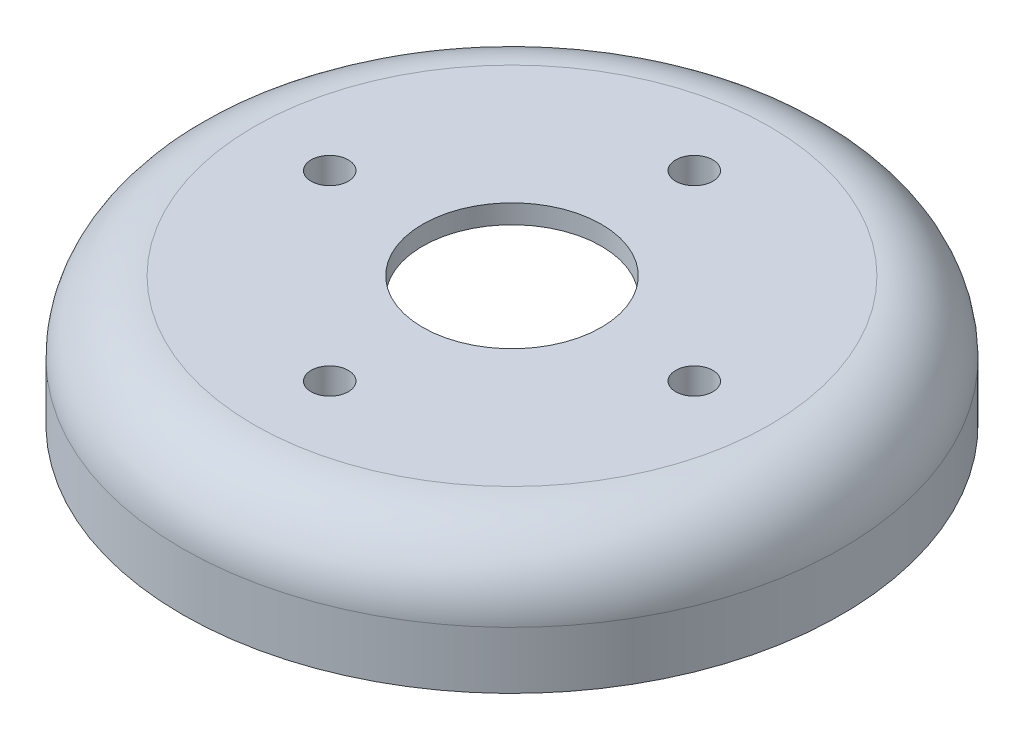
ISO-10303-21;
HEADER;
FILE_DESCRIPTION(('STEP AP214'),'2;1');
FILE_NAME('part.step','',(''),(''),'','','');
FILE_SCHEMA(('AUTOMOTIVE_DESIGN { 1 0 10303 214 1 1 1 1 }'));
ENDSEC;
DATA;
#1=APPLICATION_CONTEXT('core data for automotive mechanical design processes');
#2=APPLICATION_PROTOCOL_DEFINITION('international standard','automotive_design',2000,#1);
#3=PRODUCT_CONTEXT('',#1,'mechanical');
#4=PRODUCT('Part','Part','',(#3));
#5=PRODUCT_RELATED_PRODUCT_CATEGORY('part','',(#4));
#6=PRODUCT_DEFINITION_FORMATION('','',#4);
#7=PRODUCT_DEFINITION_CONTEXT('part definition',#1,'design');
#8=PRODUCT_DEFINITION('design','',#6,#7);
#9=PRODUCT_DEFINITION_SHAPE('','',#8);
#10=(LENGTH_UNIT() NAMED_UNIT(*) SI_UNIT(.MILLI.,.METRE.));
#11=(NAMED_UNIT(*) PLANE_ANGLE_UNIT() SI_UNIT($,.RADIAN.));
#12=(NAMED_UNIT(*) SI_UNIT($,.STERADIAN.) SOLID_ANGLE_UNIT());
#13=UNCERTAINTY_MEASURE_WITH_UNIT(LENGTH_MEASURE(1.E-05),#10,'distance_accuracy_value','');
#14=(GEOMETRIC_REPRESENTATION_CONTEXT(3) GLOBAL_UNCERTAINTY_ASSIGNED_CONTEXT((#13)) GLOBAL_UNIT_ASSIGNED_CONTEXT((#10,
#11,#12)) REPRESENTATION_CONTEXT('',''));
#15=CARTESIAN_POINT('',(0.,0.,0.));
#16=DIRECTION('',(0.,0.,1.));
#17=DIRECTION('',(1.,0.,0.));
#18=AXIS2_PLACEMENT_3D('',#15,#16,#17);
#19=CARTESIAN_POINT('',(0.,25.,0.));
#20=DIRECTION('',(0.,0.,-1.));
#21=DIRECTION('',(1.,0.,0.));
#22=AXIS2_PLACEMENT_3D('',#19,#20,#21);
#23=ELLIPSE('',#22,44.1,16.);
#24=TRIMMED_CURVE('',#23,(PARAMETER_VALUE(4.71238898038469)),
(PARAMETER_VALUE(7.85398163397448)),.T.,.PARAMETER.);
#25=CARTESIAN_POINT('',(0.,41.,0.));
#26=DIRECTION('',(0.,-1.,0.));
#27=AXIS1_PLACEMENT('',#25,#26);
#28=SURFACE_OF_REVOLUTION('',#24,#27);
#29=CARTESIAN_POINT('',(2.67122868860964E-13,37.3313317942846,-28.1));
#30=CARTESIAN_POINT('',(-0.142306873434691,37.3313338427761,-28.0999930524261));
#31=CARTESIAN_POINT('',(-0.284720527752455,37.3345259738011,-28.0882701627945));
#32=CARTESIAN_POINT('',(-0.565554287753799,37.3471809529693,-28.0417427836167));
#33=CARTESIAN_POINT('',(-0.703969257213314,37.3566515218099,-28.0069098752623));
#34=CARTESIAN_POINT('',(-0.972619592410004,37.3814870173894,-27.9153914035586));
#35=CARTESIAN_POINT('',(-1.10286494022698,37.3968445811385,-27.8587331372159));
#36=CARTESIAN_POINT('',(-1.35182114762435,37.4328868623415,-27.7254261322537));
#37=CARTESIAN_POINT('',(-1.47053409101524,37.453570614922,-27.6487810143497));
#38=CARTESIAN_POINT('',(-1.69521986678385,37.4999179504084,-27.4765076681768));
#39=CARTESIAN_POINT('',(-1.80096311461874,37.5256546980367,-27.3805999921477));
#40=CARTESIAN_POINT('',(-1.99493308067702,37.5810479488966,-27.1734360343733));
#41=CARTESIAN_POINT('',(-2.08315665231291,37.6107051546642,-27.0621770015479));
#42=CARTESIAN_POINT('',(-2.24265591545357,37.6740668799417,-26.8235407608491));
#43=CARTESIAN_POINT('',(-2.31327787760883,37.7078725146624,-26.6957534416992));
#44=CARTESIAN_POINT('',(-2.43205866781701,37.777692709103,-26.4306945528424));
#45=CARTESIAN_POINT('',(-2.48021382450186,37.8137076287616,-26.2934214372382));
#46=CARTESIAN_POINT('',(-2.55405030749385,37.888011059917,-26.0089619029531));
#47=CARTESIAN_POINT('',(-2.5790319575204,37.9263352682528,-25.8616028830053));
#48=CARTESIAN_POINT('',(-2.60345387100161,38.0031723217158,-25.5648248812369));
#49=CARTESIAN_POINT('',(-2.60289162095009,38.0416851850336,-25.4154056981436));
#50=CARTESIAN_POINT('',(-2.57601256935572,38.1183495050059,-25.1166678450923));
#51=CARTESIAN_POINT('',(-2.5493552078269,38.1564894432175,-24.9673766464918));
#52=CARTESIAN_POINT('',(-2.47035427893453,38.2308151877884,-24.6752300175285));
#53=CARTESIAN_POINT('',(-2.41801092492273,38.267001010376,-24.5323745337205));
#54=CARTESIAN_POINT('',(-2.28937985087943,38.3361257735972,-24.2584460945655));
#55=CARTESIAN_POINT('',(-2.21328170187776,38.3690877972326,-24.1272900733289));
#56=CARTESIAN_POINT('',(-2.03892385026586,38.4311340942863,-23.8795931657618));
#57=CARTESIAN_POINT('',(-1.94066689348943,38.4602188474511,-23.7630504713862));
#58=CARTESIAN_POINT('',(-1.72728994044987,38.5129901160861,-23.5510159512793));
#59=CARTESIAN_POINT('',(-1.61263998745628,38.5367910486113,-23.4550798076097));
#60=CARTESIAN_POINT('',(-1.36794180296795,38.5791664478161,-23.2839188787857));
#61=CARTESIAN_POINT('',(-1.23789630970766,38.5977418419261,-23.2086904184755));
#62=CARTESIAN_POINT('',(-0.970268767964593,38.6286243575904,-23.0834409997717));
#63=CARTESIAN_POINT('',(-0.833025966860382,38.6411014983933,-23.0327367863156));
#64=CARTESIAN_POINT('',(-0.551606919236519,38.6602168678881,-22.9549990772639));
#65=CARTESIAN_POINT('',(-0.407431694921321,38.666855954649,-22.9279621030927));
#66=CARTESIAN_POINT('',(-0.119707217003718,38.6740103110614,-22.8988246734075));
#67=CARTESIAN_POINT('',(0.0237838101355367,38.674659329903,-22.8961795849934));
#68=CARTESIAN_POINT('',(0.309153651245228,38.6701641093782,-22.9144897599824));
#69=CARTESIAN_POINT('',(0.451032562404869,38.6650202211392,-22.9354435929765));
#70=CARTESIAN_POINT('',(0.72823617017588,38.6491436752045,-23.0000400390849));
#71=CARTESIAN_POINT('',(0.863596762292676,38.638446710225,-23.0435377472742));
#72=CARTESIAN_POINT('',(1.12500024455804,38.6117936299546,-23.1517268859707));
#73=CARTESIAN_POINT('',(1.25104280441487,38.5958373283478,-23.2164190673071));
#74=CARTESIAN_POINT('',(1.4918680709356,38.5588975767552,-23.365839134178));
#75=CARTESIAN_POINT('',(1.60650335783492,38.5378580097658,-23.4507905265656));
#76=CARTESIAN_POINT('',(1.81990158024148,38.4914303176974,-23.6377200893447));
#77=CARTESIAN_POINT('',(1.91866275772123,38.4660417116129,-23.7397001430819));
#78=CARTESIAN_POINT('',(2.10017384194091,38.4109029939995,-23.9604567304529));
#79=CARTESIAN_POINT('',(2.18246302910232,38.3810599029595,-24.0795887188173));
#80=CARTESIAN_POINT('',(2.32593457353278,38.3182967068529,-24.3292047940328));
#81=CARTESIAN_POINT('',(2.38711385740124,38.2853761546234,-24.4596905304214));
#82=CARTESIAN_POINT('',(2.48846915671079,38.2163094055475,-24.7323527716134));
#83=CARTESIAN_POINT('',(2.52798292891535,38.1800972604032,-24.8747588544217));
#84=CARTESIAN_POINT('',(2.58237198862426,38.1062664731934,-25.1638501643395));
#85=CARTESIAN_POINT('',(2.5972438933638,38.0686476387464,-25.3105359761459));
#86=CARTESIAN_POINT('',(2.60211004313228,37.9921690239293,-25.6074347517141));
#87=CARTESIAN_POINT('',(2.59155277430192,37.9533001022196,-25.7576546579758));
#88=CARTESIAN_POINT('',(2.54467945816127,37.8762245045254,-26.0542064474796));
#89=CARTESIAN_POINT('',(2.50836172101106,37.8380178721544,-26.2005380750042));
#90=CARTESIAN_POINT('',(2.41059932172674,37.7632092014266,-26.4858256880305));
#91=CARTESIAN_POINT('',(2.34903697113653,37.7266155798861,-26.6247436363379));
#92=CARTESIAN_POINT('',(2.20228126399921,37.656378714025,-26.8903114969939));
#93=CARTESIAN_POINT('',(2.11709021493863,37.6227351820321,-27.0169626056456));
#94=CARTESIAN_POINT('',(1.92686860075209,37.5600658567901,-27.2520438970836));
#95=CARTESIAN_POINT('',(1.82219308694587,37.5309723343891,-27.3607430306249));
#96=CARTESIAN_POINT('',(1.59485170766245,37.4777730443141,-27.5589259438694));
#97=CARTESIAN_POINT('',(1.47218443834394,37.4536676662038,-27.6484082227968));
#98=CARTESIAN_POINT('',(1.21649886317493,37.412052239488,-27.8025471614094));
#99=CARTESIAN_POINT('',(1.08392695761435,37.3943587427173,-27.8678955797876));
#100=CARTESIAN_POINT('',(0.80914699318274,37.3652452287841,-27.9752718935421));
#101=CARTESIAN_POINT('',(0.666953767288453,37.3538157913386,-28.0173348080767));
#102=CARTESIAN_POINT('',(0.436383186810014,37.3409600784024,-28.0646176058434));
#103=CARTESIAN_POINT('',(0.34969103850503,37.3373554096008,-28.0778663422989));
#104=CARTESIAN_POINT('',(0.175346098319736,37.3325406574922,-28.095559602373));
#105=CARTESIAN_POINT('',(0.0876933234108646,37.331330531949,-28.1000042812819));
#106=CARTESIAN_POINT('',(2.67122868860964E-13,37.3313317942846,-28.1));
#107=B_SPLINE_CURVE_WITH_KNOTS('',3,(#29,#30,#31,#32,#33,#34,#35,#36,#37,#38,#39,#40,#41,#42,
#43,#44,#45,#46,#47,#48,#49,#50,#51,#52,#53,#54,#55,#56,#57,#58,#59,#60,#61,#62,#63,#64,#65,#66,
#67,#68,#69,#70,#71,#72,#73,#74,#75,#76,#77,#78,#79,#80,#81,#82,#83,#84,#85,#86,#87,#88,#89,#90,
#91,#92,#93,#94,#95,#96,#97,#98,#99,#100,#101,#102,#103,#104,#105,#106),.UNSPECIFIED.,.T.,.F.,
(4,2,2,2,2,2,2,2,2,2,2,2,2,2,2,2,2,2,2,2,2,2,2,2,2,2,2,2,2,2,2,2,2,2,2,2,2,2,4),(0.,
0.426594016365695,0.853713597864029,1.2803007056913,1.70681058880846,2.14002453006866,
2.57331620764891,3.02087555850914,3.46850802079026,3.92925350102361,4.39004431846528,
4.85693006798358,5.32381193954373,5.78705929022229,6.25024926859089,6.70213555421927,
7.15394158824088,7.59230827196769,8.03061051439033,8.4591017889713,8.88756709267247,
9.31331189815202,9.73907178757069,10.1697658440709,10.6005075663035,11.041991342711,
11.4835393678522,11.9379227942118,12.392368591857,12.8567589269715,13.3211797280657,
13.7877906928383,14.254356106238,14.713130443457,15.1719405964879,15.6163331159777,
16.060055483553,16.3229388285622,16.5858175366612),.UNSPECIFIED.);
#108=CARTESIAN_POINT('',(2.67122868860964E-13,37.3313317942846,-28.1));
#109=VERTEX_POINT('',#108);
#110=EDGE_CURVE('E82',#109,#109,#107,.T.);
#111=ORIENTED_EDGE('',*,*,#110,.T.);
#112=EDGE_LOOP('',(#111));
#113=FACE_BOUND('',#112,.T.);
#114=CARTESIAN_POINT('',(0.,38.6737213380668,22.9));
#115=CARTESIAN_POINT('',(-0.142886467899149,38.6737197732858,22.9000068491562));
#116=CARTESIAN_POINT('',(-0.285879571082559,38.670819684392,22.9118242096721));
#117=CARTESIAN_POINT('',(-0.567873630166802,38.6592952529582,22.9587405814745));
#118=CARTESIAN_POINT('',(-0.706869475610986,38.6506638953224,22.9938681244844));
#119=CARTESIAN_POINT('',(-0.976682947818749,38.6279390394313,23.086207965707));
#120=CARTESIAN_POINT('',(-1.10750914296357,38.6138513794316,23.14339665818));
#121=CARTESIAN_POINT('',(-1.35753876471003,38.5806211048273,23.278007617051));
#122=CARTESIAN_POINT('',(-1.4767445357677,38.5614795127709,23.3554257904405));
#123=CARTESIAN_POINT('',(-1.70186001787244,38.5184054065013,23.5291792041609));
#124=CARTESIAN_POINT('',(-1.8075892031433,38.494417139708,23.6257343098193));
#125=CARTESIAN_POINT('',(-2.00139081922667,38.4424490227178,23.8342556348765));
#126=CARTESIAN_POINT('',(-2.08946052559189,38.4144685577554,23.9462242277313));
#127=CARTESIAN_POINT('',(-2.24802594184411,38.3544292648229,24.185635946392));
#128=CARTESIAN_POINT('',(-2.31797377445097,38.3222796701286,24.3134191089663));
#129=CARTESIAN_POINT('',(-2.43544890005923,38.2553808247499,24.5782704584833));
#130=CARTESIAN_POINT('',(-2.48297284011484,38.2206311861919,24.7153400304799));
#131=CARTESIAN_POINT('',(-2.55558170712218,38.1484235114195,24.9989756149967));
#132=CARTESIAN_POINT('',(-2.57999965214999,38.110916840445,25.1457001686265));
#133=CARTESIAN_POINT('',(-2.60354690782133,38.0351044620681,25.4409657509096));
#134=CARTESIAN_POINT('',(-2.60267325385116,37.9967986615197,25.5895069904701));
#135=CARTESIAN_POINT('',(-2.57545591433574,37.9197601195152,25.8869222636223));
#136=CARTESIAN_POINT('',(-2.54866907091235,37.8810315554398,26.0357570691141));
#137=CARTESIAN_POINT('',(-2.46961927681884,37.8049438844818,26.326880835487));
#138=CARTESIAN_POINT('',(-2.41735550615274,37.7675848217193,26.4691695855165));
#139=CARTESIAN_POINT('',(-2.28873411449153,37.6954481572043,26.742779910762));
#140=CARTESIAN_POINT('',(-2.21242314670944,37.660665716664,26.8741221043486));
#141=CARTESIAN_POINT('',(-2.03757780081689,37.5947432858313,27.1221242052209));
#142=CARTESIAN_POINT('',(-1.9390457273241,37.5636029183169,27.2387856331394));
#143=CARTESIAN_POINT('',(-1.72482443688595,37.5067193163302,27.4512099189077));
#144=CARTESIAN_POINT('',(-1.60957210455957,37.4808702323085,27.5473846352431));
#145=CARTESIAN_POINT('',(-1.36348763001854,37.4346657173586,27.7188685007031));
#146=CARTESIAN_POINT('',(-1.23265870747254,37.4143091539622,27.7941819511656));
#147=CARTESIAN_POINT('',(-0.963894530006583,37.3804822317256,27.9191162114664));
#148=CARTESIAN_POINT('',(-0.826349834417097,37.3668020642443,27.9695205545413));
#149=CARTESIAN_POINT('',(-0.544298729959204,37.3458672518299,28.0465857558463));
#150=CARTESIAN_POINT('',(-0.399793648832703,37.3386113864946,28.0732511236914));
#151=CARTESIAN_POINT('',(-0.112324741235573,37.3309318899768,28.1014712489695));
#152=CARTESIAN_POINT('',(0.030566716419978,37.3303204725456,28.1037161817402));
#153=CARTESIAN_POINT('',(0.314668967398856,37.3354659069064,28.0848108079905));
#154=CARTESIAN_POINT('',(0.455879885559177,37.3412222826516,28.0636622503328));
#155=CARTESIAN_POINT('',(0.731430349510096,37.3588035705535,27.9989749791858));
#156=CARTESIAN_POINT('',(0.865817017695991,37.3705779647499,27.9556226480001));
#157=CARTESIAN_POINT('',(1.12530679666979,37.3997278375393,27.8480661383676));
#158=CARTESIAN_POINT('',(1.25040941277915,37.4171036143254,27.7838608497994));
#159=CARTESIAN_POINT('',(1.48992482290415,37.4571501392965,27.6354799278714));
#160=CARTESIAN_POINT('',(1.60414356149166,37.479898231563,27.5510122716154));
#161=CARTESIAN_POINT('',(1.81682824068556,37.5297670361218,27.3652297958566));
#162=CARTESIAN_POINT('',(1.91529195364557,37.5568883656717,27.2639125980736));
#163=CARTESIAN_POINT('',(2.09693151919117,37.6155471625453,27.0439691172439));
#164=CARTESIAN_POINT('',(2.17954120904998,37.6471951612286,26.9249048494671));
#165=CARTESIAN_POINT('',(2.32365689985426,37.7132616734955,26.6753272161371));
#166=CARTESIAN_POINT('',(2.38515940236782,37.7476806451907,26.5448119571247));
#167=CARTESIAN_POINT('',(2.48729998148207,37.8194358555781,26.2715471200891));
#168=CARTESIAN_POINT('',(2.52720860156311,37.8568301676056,26.128539877049));
#169=CARTESIAN_POINT('',(2.58216852467682,37.9324522469117,25.838034167456));
#170=CARTESIAN_POINT('',(2.59721663331465,37.9706801206576,25.6905351262192));
#171=CARTESIAN_POINT('',(2.60212541156158,38.0476509126815,25.392230188308));
#172=CARTESIAN_POINT('',(2.59149952792139,38.0863897230062,25.2414149383261));
#173=CARTESIAN_POINT('',(2.54423287584987,38.1625650591989,24.9435680821665));
#174=CARTESIAN_POINT('',(2.50759137094196,38.2000015481682,24.7965365832252));
#175=CARTESIAN_POINT('',(2.40918203393745,38.2724796850725,24.5107320934746));
#176=CARTESIAN_POINT('',(2.34744862158119,38.3075245371235,24.371948086926));
#177=CARTESIAN_POINT('',(2.20034913922168,38.3742781156821,24.1066365310215));
#178=CARTESIAN_POINT('',(2.11498616021495,38.405987277785,23.9801073815213));
#179=CARTESIAN_POINT('',(1.92481726950451,38.464536792526,23.7457518481962));
#180=CARTESIAN_POINT('',(1.82044320711979,38.4914632242605,23.637596768135));
#181=CARTESIAN_POINT('',(1.59392813924957,38.5404349971992,23.4404052325116));
#182=CARTESIAN_POINT('',(1.47178551909896,38.5624798943488,23.3513705162785));
#183=CARTESIAN_POINT('',(1.21705101893399,38.6004419337671,23.1977670578426));
#184=CARTESIAN_POINT('',(1.08486519923805,38.6165183268419,23.1325633395699));
#185=CARTESIAN_POINT('',(0.810995607380011,38.6429198439235,23.0253594260762));
#186=CARTESIAN_POINT('',(0.669325850240591,38.6532532533034,22.9833258041953));
#187=CARTESIAN_POINT('',(0.43883061722282,38.664935225476,22.9357826438886));
#188=CARTESIAN_POINT('',(0.351651300265703,38.6682257225908,22.9223834419516));
#189=CARTESIAN_POINT('',(0.176328185202862,38.6726192461845,22.9044900698444));
#190=CARTESIAN_POINT('',(0.0881844008406359,38.6737223037934,22.8999957729466));
#191=CARTESIAN_POINT('',(0.,38.6737213380668,22.9));
#192=B_SPLINE_CURVE_WITH_KNOTS('',3,(#114,#115,#116,#117,#118,#119,#120,#121,#122,#123,#124,
#125,#126,#127,#128,#129,#130,#131,#132,#133,#134,#135,#136,#137,#138,#139,#140,#141,#142,#143,
#144,#145,#146,#147,#148,#149,#150,#151,#152,#153,#154,#155,#156,#157,#158,#159,#160,#161,#162,
#163,#164,#165,#166,#167,#168,#169,#170,#171,#172,#173,#174,#175,#176,#177,#178,#179,#180,#181,
#182,#183,#184,#185,#186,#187,#188,#189,#190,#191),.UNSPECIFIED.,.T.,.F.,(4,2,2,2,2,2,2,2,2,2,2,
2,2,2,2,2,2,2,2,2,2,2,2,2,2,2,2,2,2,2,2,2,2,2,2,2,2,2,4),(0.,0.42833247921533,0.85719020792673,
1.28559032002297,1.71390382142704,2.14745784279894,2.58107870010756,3.02658523195556,
3.47215835733743,3.93023292636201,4.3883611898821,4.85446527630107,5.32058436565624,
5.78580466237983,6.25097673187877,6.70566159978262,7.16025264732228,7.59945284762374,
8.03856959669237,8.46524257574821,8.89188365952004,9.31500074983491,9.7381403687705,
10.1677894362626,10.5974991994387,11.0404820421583,11.4835382720932,11.9407511528778,
12.3980227776233,12.8640279968814,13.3300464088137,13.7954277074514,14.2607481580516,
14.7165823874571,15.1724580653544,15.6151052937064,16.0571122483515,16.3214674469382,
16.5858188834011),.UNSPECIFIED.);
#193=CARTESIAN_POINT('',(0.,38.6737213380668,22.9));
#194=VERTEX_POINT('',#193);
#195=EDGE_CURVE('E69',#194,#194,#192,.T.);
#196=ORIENTED_EDGE('',*,*,#195,.T.);
#197=EDGE_LOOP('',(#196));
#198=FACE_BOUND('',#197,.T.);
#199=CARTESIAN_POINT('',(0.,25.,0.));
#200=DIRECTION('',(0.,-1.,0.));
#201=DIRECTION('',(0.,0.,-1.));
#202=AXIS2_PLACEMENT_3D('',#199,#200,#201);
#203=CIRCLE('',#202,44.1);
#204=CARTESIAN_POINT('',(0.,25.,-44.1));
#205=VERTEX_POINT('',#204);
#206=EDGE_CURVE('E47',#205,#205,#203,.T.);
#207=ORIENTED_EDGE('',*,*,#206,.T.);
#208=EDGE_LOOP('',(#207));
#209=FACE_BOUND('',#208,.T.);
#210=CARTESIAN_POINT('',(0.,40.3438078106513,0.));
#211=DIRECTION('',(0.,-1.,0.));
#212=DIRECTION('',(0.,0.,-1.));
#213=AXIS2_PLACEMENT_3D('',#210,#211,#212);
#214=CIRCLE('',#213,12.5);
#215=CARTESIAN_POINT('',(0.,40.3438078106513,-12.5));
#216=VERTEX_POINT('',#215);
#217=EDGE_CURVE('E121',#216,#216,#214,.F.);
#218=ORIENTED_EDGE('',*,*,#217,.T.);
#219=EDGE_LOOP('',(#218));
#220=FACE_BOUND('',#219,.T.);
#221=CARTESIAN_POINT('',(-25.5,38.0198386904722,-2.60000000000018));
#222=CARTESIAN_POINT('',(-25.575028160352,38.0004958152863,-2.60000097197229));
#223=CARTESIAN_POINT('',(-25.650035270864,37.9811151157136,-2.59675147384701));
#224=CARTESIAN_POINT('',(-25.7995093304229,37.94240674267,-2.58378031848541));
#225=CARTESIAN_POINT('',(-25.8739762592771,37.9230790711979,-2.57405842054999));
#226=CARTESIAN_POINT('',(-26.0218991457198,37.8846004655105,-2.54818788936221));
#227=CARTESIAN_POINT('',(-26.0953542768876,37.8654496795434,-2.53203429152555));
#228=CARTESIAN_POINT('',(-26.2407230474106,37.8274666603668,-2.4933908050528));
#229=CARTESIAN_POINT('',(-26.3126351360835,37.8086347512834,-2.4708948366461));
#230=CARTESIAN_POINT('',(-26.5251064896823,37.7528732248748,-2.39411539613192));
#231=CARTESIAN_POINT('',(-26.6625986098704,37.7166263367481,-2.33050572052514));
#232=CARTESIAN_POINT('',(-26.9250075830975,37.6471725163202,-2.17995924373038));
#233=CARTESIAN_POINT('',(-27.0499266597806,37.6139650465678,-2.09302657740571));
#234=CARTESIAN_POINT('',(-27.2240632062342,37.5675123273897,-1.94762547949081));
#235=CARTESIAN_POINT('',(-27.2795821050958,37.5526738296191,-1.89703526572736));
#236=CARTESIAN_POINT('',(-27.3861425354409,37.524146745031,-1.7911164227173));
#237=CARTESIAN_POINT('',(-27.4371882376085,37.5104570875821,-1.73579230445893));
#238=CARTESIAN_POINT('',(-27.5344312981243,37.4843389905742,-1.62072944631648));
#239=CARTESIAN_POINT('',(-27.5806273378941,37.4719108940521,-1.56098951329804));
#240=CARTESIAN_POINT('',(-27.6677622903068,37.4484377414836,-1.43754105525484));
#241=CARTESIAN_POINT('',(-27.7087001732689,37.4373929563353,-1.37383175654369));
#242=CARTESIAN_POINT('',(-27.820574910886,37.4071750670889,-1.18167737786105));
#243=CARTESIAN_POINT('',(-27.8838470769132,37.3900373815746,-1.04831277990614));
#244=CARTESIAN_POINT('',(-27.9870222373576,37.3620544469813,-0.77230033487894));
#245=CARTESIAN_POINT('',(-28.0269301688261,37.3512078685451,-0.629654456099932));
#246=CARTESIAN_POINT('',(-28.0811252790164,37.3364706220523,-0.34389152680301));
#247=CARTESIAN_POINT('',(-28.0961809554761,37.3323713222893,-0.200931285673063));
#248=CARTESIAN_POINT('',(-28.1025386516896,37.3306407908959,0.0855430442917488));
#249=CARTESIAN_POINT('',(-28.0938433270195,37.3330088361581,0.229057069416948));
#250=CARTESIAN_POINT('',(-28.0533144831104,37.3440343662319,0.51038239244909));
#251=CARTESIAN_POINT('',(-28.0218192894064,37.3525998862235,0.648246271264377));
#252=CARTESIAN_POINT('',(-27.9371332068698,37.3755905177979,0.916614789597299));
#253=CARTESIAN_POINT('',(-27.883941828904,37.3900157614864,1.04711926312407));
#254=CARTESIAN_POINT('',(-27.7569857575521,37.4243623990245,1.29847083309694));
#255=CARTESIAN_POINT('',(-27.6830320443026,37.444334270346,1.41921541416512));
#256=CARTESIAN_POINT('',(-27.5170719241406,37.4890185676329,1.64658409918919));
#257=CARTESIAN_POINT('',(-27.4250633072277,37.5137315739261,1.75320647184525));
#258=CARTESIAN_POINT('',(-27.2228819673298,37.567848227281,1.9525337403522));
#259=CARTESIAN_POINT('',(-27.112272708627,37.5973638564754,2.04476523949648));
#260=CARTESIAN_POINT('',(-26.8780074048389,37.6596309972225,2.20943560744314));
#261=CARTESIAN_POINT('',(-26.754349189998,37.6923830468633,2.28187117740502));
#262=CARTESIAN_POINT('',(-26.49308135961,37.7612937626895,2.40738014852803));
#263=CARTESIAN_POINT('',(-26.3551450101836,37.7975293953896,2.45973152221349));
#264=CARTESIAN_POINT('',(-26.0727602473853,37.8713821884459,2.54037713436203));
#265=CARTESIAN_POINT('',(-25.9283109026784,37.9089995462404,2.56866792068499));
#266=CARTESIAN_POINT('',(-25.6333405925878,37.9854744318393,2.6009122746541));
#267=CARTESIAN_POINT('',(-25.482756823033,38.0243402523446,2.60427458226946));
#268=CARTESIAN_POINT('',(-25.1830688055756,38.1013480978298,2.58497656695936));
#269=CARTESIAN_POINT('',(-25.0339646444976,38.1394900804528,2.56231472592111));
#270=CARTESIAN_POINT('',(-24.7408406047164,38.2141601569285,2.49128777405532));
#271=CARTESIAN_POINT('',(-24.596845700273,38.2506804975838,2.4428111381239));
#272=CARTESIAN_POINT('',(-24.3189114075186,38.3209000810477,2.32121358545846));
#273=CARTESIAN_POINT('',(-24.184971401779,38.3545994970918,2.24809418344788));
#274=CARTESIAN_POINT('',(-23.9333338741475,38.4176974750083,2.08039762721744));
#275=CARTESIAN_POINT('',(-23.8154121691878,38.4471558440393,1.98617971780434));
#276=CARTESIAN_POINT('',(-23.5971166245722,38.5015360723466,1.77813301463604));
#277=CARTESIAN_POINT('',(-23.496740045192,38.5264586399272,1.66430728822229));
#278=CARTESIAN_POINT('',(-23.319463315721,38.5703781190669,1.42371211266836));
#279=CARTESIAN_POINT('',(-23.2419796096797,38.5895226557319,1.29739965748132));
#280=CARTESIAN_POINT('',(-23.1093816196026,38.6222352251541,1.03287019450798));
#281=CARTESIAN_POINT('',(-23.0542634185304,38.6358042344,0.894655276432621));
#282=CARTESIAN_POINT('',(-22.9695241885168,38.6566477567695,0.614426313020912));
#283=CARTESIAN_POINT('',(-22.9392315702514,38.6640880953009,0.472627457716488));
#284=CARTESIAN_POINT('',(-22.9026207369564,38.6730787430365,0.185789113138036));
#285=CARTESIAN_POINT('',(-22.8962998138891,38.6746297175513,0.0407499917730067));
#286=CARTESIAN_POINT('',(-22.9077496359516,38.671818881519,-0.245940814381126));
#287=CARTESIAN_POINT('',(-22.9251302098284,38.6675528302626,-0.387609226113347));
#288=CARTESIAN_POINT('',(-22.9827137472229,38.653403477459,-0.665930917536021));
#289=CARTESIAN_POINT('',(-23.0229163591044,38.6435202624596,-0.802584274462674));
#290=CARTESIAN_POINT('',(-23.1249071746914,38.6184049578714,-1.06727764273138));
#291=CARTESIAN_POINT('',(-23.1867269520357,38.6031650442163,-1.1953047266847));
#292=CARTESIAN_POINT('',(-23.3299817601549,38.5677703144022,-1.43910208110267));
#293=CARTESIAN_POINT('',(-23.4114173815329,38.5476153502582,-1.55487198237111));
#294=CARTESIAN_POINT('',(-23.5930695545643,38.5025338527996,-1.77317275948658));
#295=CARTESIAN_POINT('',(-23.6935983831393,38.477527806922,-1.87542715832644));
#296=CARTESIAN_POINT('',(-23.9094768055845,38.4236547691204,-2.06169130974817));
#297=CARTESIAN_POINT('',(-24.0248319387989,38.39478633398,-2.14569421155838));
#298=CARTESIAN_POINT('',(-24.2705291950318,38.3330763643496,-2.29558322939858));
#299=CARTESIAN_POINT('',(-24.4012045518795,38.3001450997489,-2.36088532507653));
#300=CARTESIAN_POINT('',(-24.6709728093838,38.2318868098307,-2.46855562921122));
#301=CARTESIAN_POINT('',(-24.8100570752265,38.1965622377658,-2.51094693373504));
#302=CARTESIAN_POINT('',(-25.041588551431,38.1375097924575,-2.56093603384876));
#303=CARTESIAN_POINT('',(-25.1326931469223,38.1142127471009,-2.57557388300833));
#304=CARTESIAN_POINT('',(-25.315875712067,38.0672423450454,-2.59510534668562));
#305=CARTESIAN_POINT('',(-25.407953697045,38.043568982419,-2.59999880756206));
#306=CARTESIAN_POINT('',(-25.5,38.0198386904722,-2.60000000000018));
#307=B_SPLINE_CURVE_WITH_KNOTS('',3,(#221,#222,#223,#224,#225,#226,#227,#228,#229,#230,#231,
#232,#233,#234,#235,#236,#237,#238,#239,#240,#241,#242,#243,#244,#245,#246,#247,#248,#249,#250,
#251,#252,#253,#254,#255,#256,#257,#258,#259,#260,#261,#262,#263,#264,#265,#266,#267,#268,#269,
#270,#271,#272,#273,#274,#275,#276,#277,#278,#279,#280,#281,#282,#283,#284,#285,#286,#287,#288,
#289,#290,#291,#292,#293,#294,#295,#296,#297,#298,#299,#300,#301,#302,#303,#304,#305,#306),
.UNSPECIFIED.,.T.,.F.,(4,2,2,2,2,2,2,2,2,2,2,2,2,2,2,2,2,2,2,2,2,2,2,2,2,2,2,2,2,2,2,2,2,2,2,2,
2,2,2,2,2,2,4),(0.,0.232356831992773,0.464722305479084,0.697267489057424,0.930036351896999,
1.39496018520496,1.85980164796126,2.0892519979859,2.31848608668666,2.54778234147812,
2.77712343007547,3.2205274863084,3.66383781383765,4.09316386033806,4.52244190628253,
4.94547718696797,5.36852200537102,5.79555059268254,6.22263148283128,6.66167311626177,
7.10078786807877,7.55446964022927,8.00821649428845,8.47269200735941,8.93719461688027,
9.40372044794005,9.87021760816114,10.3293056780462,10.7883219957734,11.2343594068702,
11.6803186663837,12.113773529996,12.5471794255619,12.9735361108409,13.3998862270988,
13.8268616817067,14.253849993503,14.6885404057455,15.1233936999538,15.5706300715933,
16.0174147451743,16.3024710498669,16.5875318490511),.UNSPECIFIED.);
#308=CARTESIAN_POINT('',(-25.5,38.0198386904722,-2.60000000000018));
#309=VERTEX_POINT('',#308);
#310=EDGE_CURVE('E77',#309,#309,#307,.T.);
#311=ORIENTED_EDGE('',*,*,#310,.T.);
#312=EDGE_LOOP('',(#311));
#313=FACE_BOUND('',#312,.T.);
#314=CARTESIAN_POINT('',(22.9,38.6737213380668,0.));
#315=CARTESIAN_POINT('',(22.9000068491562,38.6737197732858,0.14288646789906));
#316=CARTESIAN_POINT('',(22.9118242096721,38.6708196843919,0.28587957108247));
#317=CARTESIAN_POINT('',(22.9587405814745,38.6592952529582,0.567873630166714));
#318=CARTESIAN_POINT('',(22.9938681244844,38.6506638953224,0.706869475610898));
#319=CARTESIAN_POINT('',(23.086207965707,38.6279390394313,0.976682947818661));
#320=CARTESIAN_POINT('',(23.14339665818,38.6138513794316,1.10750914296348));
#321=CARTESIAN_POINT('',(23.278007617051,38.5806211048273,1.35753876470994));
#322=CARTESIAN_POINT('',(23.3554257904405,38.5614795127709,1.47674453576761));
#323=CARTESIAN_POINT('',(23.5291792041609,38.5184054065013,1.70186001787235));
#324=CARTESIAN_POINT('',(23.6257343098193,38.494417139708,1.80758920314321));
#325=CARTESIAN_POINT('',(23.8342556348765,38.4424490227178,2.00139081922659));
#326=CARTESIAN_POINT('',(23.9462242277313,38.4144685577554,2.0894605255918));
#327=CARTESIAN_POINT('',(24.185635946392,38.3544292648229,2.24802594184402));
#328=CARTESIAN_POINT('',(24.3134191089663,38.3222796701286,2.31797377445089));
#329=CARTESIAN_POINT('',(24.5782704584833,38.2553808247499,2.43544890005914));
#330=CARTESIAN_POINT('',(24.7153400304799,38.2206311861919,2.48297284011475));
#331=CARTESIAN_POINT('',(24.9989756149967,38.1484235114195,2.5555817071221));
#332=CARTESIAN_POINT('',(25.1457001686265,38.110916840445,2.5799996521499));
#333=CARTESIAN_POINT('',(25.4409657509096,38.0351044620681,2.60354690782124));
#334=CARTESIAN_POINT('',(25.5895069904701,37.9967986615197,2.60267325385106));
#335=CARTESIAN_POINT('',(25.8869222636223,37.9197601195152,2.57545591433565));
#336=CARTESIAN_POINT('',(26.0357570691141,37.8810315554398,2.54866907091227));
#337=CARTESIAN_POINT('',(26.326880835487,37.8049438844818,2.46961927681875));
#338=CARTESIAN_POINT('',(26.4691695855165,37.7675848217193,2.41735550615264));
#339=CARTESIAN_POINT('',(26.742779910762,37.6954481572043,2.28873411449143));
#340=CARTESIAN_POINT('',(26.8741221043486,37.660665716664,2.21242314670936));
#341=CARTESIAN_POINT('',(27.1221242052209,37.5947432858313,2.03757780081681));
#342=CARTESIAN_POINT('',(27.2387856331394,37.5636029183169,1.93904572732402));
#343=CARTESIAN_POINT('',(27.4512099189077,37.5067193163302,1.72482443688586));
#344=CARTESIAN_POINT('',(27.5473846352431,37.4808702323085,1.60957210455948));
#345=CARTESIAN_POINT('',(27.7188685007031,37.4346657173586,1.36348763001845));
#346=CARTESIAN_POINT('',(27.7941819511656,37.4143091539622,1.23265870747245));
#347=CARTESIAN_POINT('',(27.9191162114664,37.3804822317256,0.963894530006491));
#348=CARTESIAN_POINT('',(27.9695205545413,37.3668020642443,0.826349834417005));
#349=CARTESIAN_POINT('',(28.0465857558463,37.3458672518299,0.544298729959115));
#350=CARTESIAN_POINT('',(28.0732511236914,37.3386113864946,0.399793648832616));
#351=CARTESIAN_POINT('',(28.1014712489695,37.3309318899768,0.11232474123549));
#352=CARTESIAN_POINT('',(28.1037161817402,37.3303204725456,-0.030566716420059));
#353=CARTESIAN_POINT('',(28.0848108079905,37.3354659069064,-0.314668967398933));
#354=CARTESIAN_POINT('',(28.0636622503328,37.3412222826516,-0.455879885559252));
#355=CARTESIAN_POINT('',(27.9989749791858,37.3588035705535,-0.731430349510171));
#356=CARTESIAN_POINT('',(27.9556226480002,37.3705779647499,-0.865817017696068));
#357=CARTESIAN_POINT('',(27.8480661383677,37.3997278375393,-1.12530679666987));
#358=CARTESIAN_POINT('',(27.7838608497994,37.4171036143254,-1.25040941277924));
#359=CARTESIAN_POINT('',(27.6354799278715,37.4571501392965,-1.48992482290425));
#360=CARTESIAN_POINT('',(27.5510122716154,37.479898231563,-1.60414356149174));
#361=CARTESIAN_POINT('',(27.3652297958566,37.5297670361218,-1.81682824068565));
#362=CARTESIAN_POINT('',(27.2639125980736,37.5568883656717,-1.91529195364566));
#363=CARTESIAN_POINT('',(27.0439691172439,37.6155471625453,-2.09693151919127));
#364=CARTESIAN_POINT('',(26.9249048494671,37.6471951612286,-2.17954120905007));
#365=CARTESIAN_POINT('',(26.6753272161371,37.7132616734955,-2.32365689985435));
#366=CARTESIAN_POINT('',(26.5448119571247,37.7476806451907,-2.38515940236791));
#367=CARTESIAN_POINT('',(26.2715471200891,37.8194358555781,-2.48729998148216));
#368=CARTESIAN_POINT('',(26.128539877049,37.8568301676056,-2.52720860156319));
#369=CARTESIAN_POINT('',(25.8380341674561,37.9324522469117,-2.58216852467691));
#370=CARTESIAN_POINT('',(25.6905351262192,37.9706801206576,-2.59721663331473));
#371=CARTESIAN_POINT('',(25.392230188308,38.0476509126815,-2.60212541156167));
#372=CARTESIAN_POINT('',(25.2414149383261,38.0863897230062,-2.59149952792148));
#373=CARTESIAN_POINT('',(24.9435680821665,38.1625650591989,-2.54423287584996));
#374=CARTESIAN_POINT('',(24.7965365832252,38.2000015481682,-2.50759137094205));
#375=CARTESIAN_POINT('',(24.5107320934746,38.2724796850725,-2.40918203393752));
#376=CARTESIAN_POINT('',(24.371948086926,38.3075245371235,-2.34744862158127));
#377=CARTESIAN_POINT('',(24.1066365310215,38.3742781156821,-2.20034913922177));
#378=CARTESIAN_POINT('',(23.9801073815213,38.405987277785,-2.11498616021504));
#379=CARTESIAN_POINT('',(23.7457518481962,38.464536792526,-1.9248172695046));
#380=CARTESIAN_POINT('',(23.637596768135,38.4914632242605,-1.82044320711987));
#381=CARTESIAN_POINT('',(23.4404052325116,38.5404349971992,-1.59392813924965));
#382=CARTESIAN_POINT('',(23.3513705162785,38.5624798943488,-1.47178551909906));
#383=CARTESIAN_POINT('',(23.1977670578426,38.6004419337671,-1.21705101893409));
#384=CARTESIAN_POINT('',(23.1325633395699,38.6165183268419,-1.08486519923815));
#385=CARTESIAN_POINT('',(23.0253594260762,38.6429198439235,-0.810995607380102));
#386=CARTESIAN_POINT('',(22.9833258041953,38.6532532533034,-0.669325850240685));
#387=CARTESIAN_POINT('',(22.9357826438886,38.664935225476,-0.438830617222914));
#388=CARTESIAN_POINT('',(22.9223834419516,38.6682257225908,-0.351651300265796));
#389=CARTESIAN_POINT('',(22.9044900698444,38.6726192461845,-0.176328185202953));
#390=CARTESIAN_POINT('',(22.8999957729466,38.6737223037934,-0.0881844008407262));
#391=CARTESIAN_POINT('',(22.9,38.6737213380668,0.));
#392=B_SPLINE_CURVE_WITH_KNOTS('',3,(#314,#315,#316,#317,#318,#319,#320,#321,#322,#323,#324,
#325,#326,#327,#328,#329,#330,#331,#332,#333,#334,#335,#336,#337,#338,#339,#340,#341,#342,#343,
#344,#345,#346,#347,#348,#349,#350,#351,#352,#353,#354,#355,#356,#357,#358,#359,#360,#361,#362,
#363,#364,#365,#366,#367,#368,#369,#370,#371,#372,#373,#374,#375,#376,#377,#378,#379,#380,#381,
#382,#383,#384,#385,#386,#387,#388,#389,#390,#391),.UNSPECIFIED.,.T.,.F.,(4,2,2,2,2,2,2,2,2,2,2,
2,2,2,2,2,2,2,2,2,2,2,2,2,2,2,2,2,2,2,2,2,2,2,2,2,2,2,4),(0.,0.428332479215332,
0.857190207926731,1.28559032002297,1.71390382142704,2.14745784279895,2.58107870010757,
3.02658523195557,3.47215835733743,3.930232926362,4.38836118988207,4.85446527630104,
5.32058436565622,5.78580466237982,6.25097673187877,6.70566159978261,7.16025264732229,
7.59945284762373,8.03856959669237,8.46524257574819,8.89188365952002,9.3150007498349,
9.73814036877049,10.1677894362626,10.5974991994387,11.0404820421583,11.4835382720932,
11.9407511528778,12.3980227776233,12.8640279968814,13.3300464088137,13.7954277074514,
14.2607481580516,14.7165823874571,15.1724580653544,15.6151052937064,16.0571122483515,
16.3214674469382,16.5858188834011),.UNSPECIFIED.);
#393=CARTESIAN_POINT('',(22.9,38.6737213380668,0.));
#394=VERTEX_POINT('',#393);
#395=EDGE_CURVE('E52',#394,#394,#392,.T.);
#396=ORIENTED_EDGE('',*,*,#395,.T.);
#397=EDGE_LOOP('',(#396));
#398=FACE_BOUND('',#397,.T.);
#399=ADVANCED_FACE('F32',(#113,#198,#209,#220,#313,#398),#28,.F.);
#400=CARTESIAN_POINT('',(0.,43.,0.));
#401=DIRECTION('',(0.,1.,0.));
#402=DIRECTION('',(0.,0.,1.));
#403=AXIS2_PLACEMENT_3D('',#400,#401,#402);
#404=PLANE('',#403);
#405=CARTESIAN_POINT('',(0.,43.,0.));
#406=DIRECTION('',(0.,1.,0.));
#407=DIRECTION('',(0.,0.,1.));
#408=AXIS2_PLACEMENT_3D('',#405,#406,#407);
#409=CIRCLE('',#408,36.1);
#410=CARTESIAN_POINT('',(0.,43.,36.1));
#411=VERTEX_POINT('',#410);
#412=EDGE_CURVE('E10',#411,#411,#409,.T.);
#413=ORIENTED_EDGE('',*,*,#412,.T.);
#414=EDGE_LOOP('',(#413));
#415=FACE_BOUND('',#414,.T.);
#416=CARTESIAN_POINT('',(25.5,43.,0.));
#417=DIRECTION('',(0.,1.,0.));
#418=DIRECTION('',(0.,0.,1.));
#419=AXIS2_PLACEMENT_3D('',#416,#417,#418);
#420=CIRCLE('',#419,2.6);
#421=CARTESIAN_POINT('',(25.5,43.,2.6));
#422=VERTEX_POINT('',#421);
#423=EDGE_CURVE('E132',#422,#422,#420,.T.);
#424=ORIENTED_EDGE('',*,*,#423,.F.);
#425=EDGE_LOOP('',(#424));
#426=FACE_BOUND('',#425,.T.);
#427=CARTESIAN_POINT('',(2.670983224215E-13,43.,-25.5));
#428=DIRECTION('',(0.,1.,0.));
#429=DIRECTION('',(0.,0.,1.));
#430=AXIS2_PLACEMENT_3D('',#427,#428,#429);
#431=CIRCLE('',#430,2.6);
#432=CARTESIAN_POINT('',(2.670983224215E-13,43.,-22.9));
#433=VERTEX_POINT('',#432);
#434=EDGE_CURVE('E143',#433,#433,#431,.T.);
#435=ORIENTED_EDGE('',*,*,#434,.F.);
#436=EDGE_LOOP('',(#435));
#437=FACE_BOUND('',#436,.T.);
#438=CARTESIAN_POINT('',(-25.5,43.,-1.78065548281E-13));
#439=DIRECTION('',(0.,1.,0.));
#440=DIRECTION('',(0.,0.,1.));
#441=AXIS2_PLACEMENT_3D('',#438,#439,#440);
#442=CIRCLE('',#441,2.6);
#443=CARTESIAN_POINT('',(-25.5,43.,2.59999999999982));
#444=VERTEX_POINT('',#443);
#445=EDGE_CURVE('E140',#444,#444,#442,.T.);
#446=ORIENTED_EDGE('',*,*,#445,.F.);
#447=EDGE_LOOP('',(#446));
#448=FACE_BOUND('',#447,.T.);
#449=CARTESIAN_POINT('',(0.,43.,25.5));
#450=DIRECTION('',(0.,1.,0.));
#451=DIRECTION('',(0.,0.,1.));
#452=AXIS2_PLACEMENT_3D('',#449,#450,#451);
#453=CIRCLE('',#452,2.6);
#454=CARTESIAN_POINT('',(0.,43.,28.1));
#455=VERTEX_POINT('',#454);
#456=EDGE_CURVE('E137',#455,#455,#453,.T.);
#457=ORIENTED_EDGE('',*,*,#456,.F.);
#458=EDGE_LOOP('',(#457));
#459=FACE_BOUND('',#458,.T.);
#460=CARTESIAN_POINT('',(0.,43.,0.));
#461=DIRECTION('',(0.,1.,0.));
#462=DIRECTION('',(0.,0.,1.));
#463=AXIS2_PLACEMENT_3D('',#460,#461,#462);
#464=CIRCLE('',#463,12.5);
#465=CARTESIAN_POINT('',(0.,43.,12.5));
#466=VERTEX_POINT('',#465);
#467=EDGE_CURVE('E134',#466,#466,#464,.T.);
#468=ORIENTED_EDGE('',*,*,#467,.F.);
#469=EDGE_LOOP('',(#468));
#470=FACE_BOUND('',#469,.T.);
#471=ADVANCED_FACE('F63',(#415,#426,#437,#448,#459,#470),#404,.T.);
#472=CARTESIAN_POINT('',(0.,41.,0.));
#473=DIRECTION('',(0.,-1.,0.));
#474=DIRECTION('',(0.,0.,-1.));
#475=AXIS2_PLACEMENT_3D('',#472,#473,#474);
#476=CYLINDRICAL_SURFACE('',#475,46.1);
#477=CARTESIAN_POINT('',(0.,33.,0.));
#478=DIRECTION('',(0.,1.,0.));
#479=DIRECTION('',(0.,0.,1.));
#480=AXIS2_PLACEMENT_3D('',#477,#478,#479);
#481=CIRCLE('',#480,46.1);
#482=CARTESIAN_POINT('',(0.,33.,46.1));
#483=VERTEX_POINT('',#482);
#484=EDGE_CURVE('E39',#483,#483,#481,.F.);
#485=ORIENTED_EDGE('',*,*,#484,.T.);
#486=EDGE_LOOP('',(#485));
#487=FACE_BOUND('',#486,.T.);
#488=CARTESIAN_POINT('',(0.,25.,0.));
#489=DIRECTION('',(0.,-1.,0.));
#490=DIRECTION('',(0.,0.,-1.));
#491=AXIS2_PLACEMENT_3D('',#488,#489,#490);
#492=CIRCLE('',#491,46.1);
#493=CARTESIAN_POINT('',(0.,25.,-46.1));
#494=VERTEX_POINT('',#493);
#495=EDGE_CURVE('E43',#494,#494,#492,.T.);
#496=ORIENTED_EDGE('',*,*,#495,.F.);
#497=EDGE_LOOP('',(#496));
#498=FACE_BOUND('',#497,.T.);
#499=ADVANCED_FACE('F106',(#487,#498),#476,.T.);
#500=CARTESIAN_POINT('',(46.1,25.,0.));
#501=DIRECTION('',(0.,-1.,0.));
#502=DIRECTION('',(0.,0.,-1.));
#503=AXIS2_PLACEMENT_3D('',#500,#501,#502);
#504=PLANE('',#503);
#505=ORIENTED_EDGE('',*,*,#495,.T.);
#506=EDGE_LOOP('',(#505));
#507=FACE_BOUND('',#506,.T.);
#508=ORIENTED_EDGE('',*,*,#206,.F.);
#509=EDGE_LOOP('',(#508));
#510=FACE_BOUND('',#509,.T.);
#511=ADVANCED_FACE('F99',(#507,#510),#504,.T.);
#512=CARTESIAN_POINT('',(0.,43.,0.));
#513=DIRECTION('',(0.,-1.,0.));
#514=DIRECTION('',(0.,0.,-1.));
#515=AXIS2_PLACEMENT_3D('',#512,#513,#514);
#516=CYLINDRICAL_SURFACE('',#515,12.5);
#517=ORIENTED_EDGE('',*,*,#217,.F.);
#518=EDGE_LOOP('',(#517));
#519=FACE_BOUND('',#518,.T.);
#520=ORIENTED_EDGE('',*,*,#467,.T.);
#521=EDGE_LOOP('',(#520));
#522=FACE_BOUND('',#521,.T.);
#523=ADVANCED_FACE('F96',(#519,#522),#516,.F.);
#524=CARTESIAN_POINT('',(0.,43.,25.5));
#525=DIRECTION('',(0.,-1.,0.));
#526=DIRECTION('',(0.,0.,-1.));
#527=AXIS2_PLACEMENT_3D('',#524,#525,#526);
#528=CYLINDRICAL_SURFACE('',#527,2.6);
#529=ORIENTED_EDGE('',*,*,#195,.F.);
#530=EDGE_LOOP('',(#529));
#531=FACE_BOUND('',#530,.T.);
#532=ORIENTED_EDGE('',*,*,#456,.T.);
#533=EDGE_LOOP('',(#532));
#534=FACE_BOUND('',#533,.T.);
#535=ADVANCED_FACE('F98',(#531,#534),#528,.F.);
#536=CARTESIAN_POINT('',(-25.5,43.,-1.78065548281E-13));
#537=DIRECTION('',(0.,-1.,0.));
#538=DIRECTION('',(0.,0.,-1.));
#539=AXIS2_PLACEMENT_3D('',#536,#537,#538);
#540=CYLINDRICAL_SURFACE('',#539,2.6);
#541=ORIENTED_EDGE('',*,*,#310,.F.);
#542=EDGE_LOOP('',(#541));
#543=FACE_BOUND('',#542,.T.);
#544=ORIENTED_EDGE('',*,*,#445,.T.);
#545=EDGE_LOOP('',(#544));
#546=FACE_BOUND('',#545,.T.);
#547=ADVANCED_FACE('F93',(#543,#546),#540,.F.);
#548=CARTESIAN_POINT('',(2.670983224215E-13,43.,-25.5));
#549=DIRECTION('',(0.,-1.,0.));
#550=DIRECTION('',(0.,0.,-1.));
#551=AXIS2_PLACEMENT_3D('',#548,#549,#550);
#552=CYLINDRICAL_SURFACE('',#551,2.6);
#553=ORIENTED_EDGE('',*,*,#110,.F.);
#554=EDGE_LOOP('',(#553));
#555=FACE_BOUND('',#554,.T.);
#556=ORIENTED_EDGE('',*,*,#434,.T.);
#557=EDGE_LOOP('',(#556));
#558=FACE_BOUND('',#557,.T.);
#559=ADVANCED_FACE('F88',(#555,#558),#552,.F.);
#560=CARTESIAN_POINT('',(25.5,43.,0.));
#561=DIRECTION('',(0.,-1.,0.));
#562=DIRECTION('',(0.,0.,-1.));
#563=AXIS2_PLACEMENT_3D('',#560,#561,#562);
#564=CYLINDRICAL_SURFACE('',#563,2.6);
#565=ORIENTED_EDGE('',*,*,#395,.F.);
#566=EDGE_LOOP('',(#565));
#567=FACE_BOUND('',#566,.T.);
#568=ORIENTED_EDGE('',*,*,#423,.T.);
#569=EDGE_LOOP('',(#568));
#570=FACE_BOUND('',#569,.T.);
#571=ADVANCED_FACE('F92',(#567,#570),#564,.F.);
#572=CARTESIAN_POINT('',(0.,33.,0.));
#573=DIRECTION('',(0.,1.,0.));
#574=DIRECTION('',(0.,0.,1.));
#575=AXIS2_PLACEMENT_3D('',#572,#573,#574);
#576=TOROIDAL_SURFACE('',#575,36.1,10.);
#577=ORIENTED_EDGE('',*,*,#412,.F.);
#578=EDGE_LOOP('',(#577));
#579=FACE_BOUND('',#578,.T.);
#580=ORIENTED_EDGE('',*,*,#484,.F.);
#581=EDGE_LOOP('',(#580));
#582=FACE_BOUND('',#581,.T.);
#583=ADVANCED_FACE('F34',(#579,#582),#576,.T.);
#584=CLOSED_SHELL('',(#399,#471,#499,#511,#523,#535,#547,#559,#571,#583));
#585=MANIFOLD_SOLID_BREP('B2',#584);
#586=ADVANCED_BREP_SHAPE_REPRESENTATION('',(#18,#585),#14);
#587=SHAPE_DEFINITION_REPRESENTATION(#9,#586);
ENDSEC;
END-ISO-10303-21;
